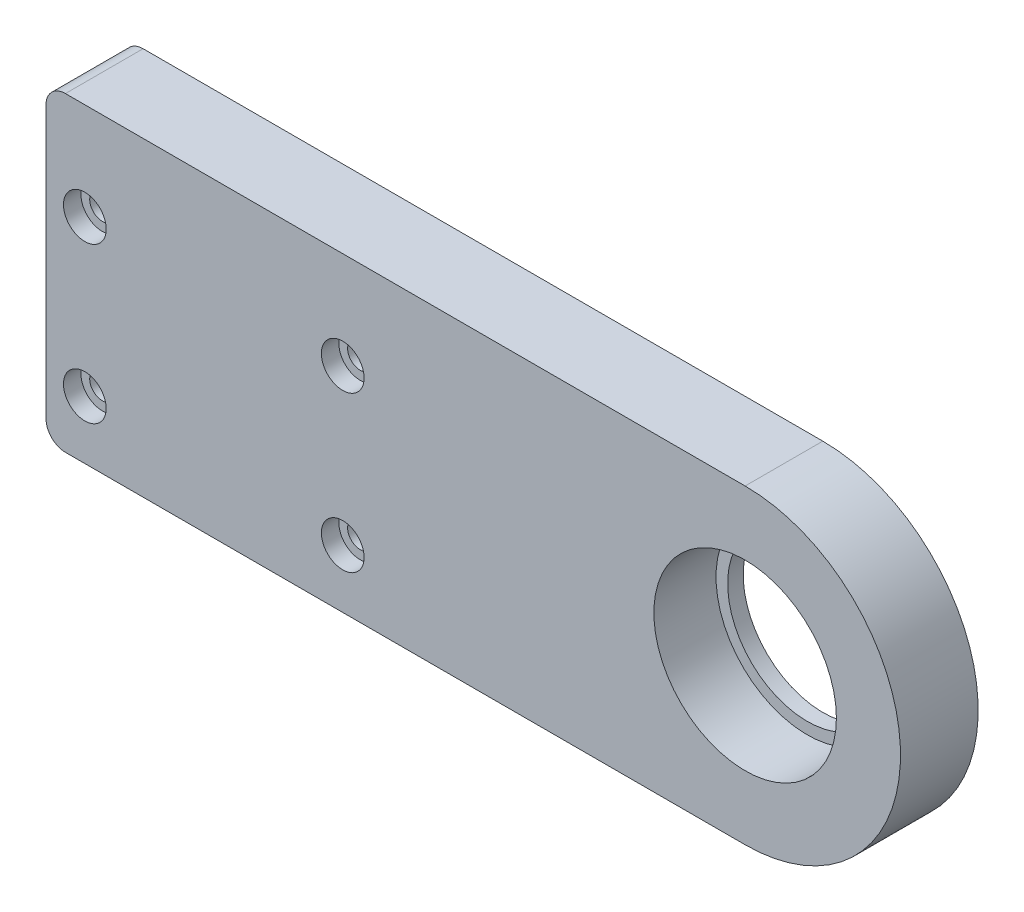
ISO-10303-21;
HEADER;
FILE_DESCRIPTION(('STEP AP214'),'2;1');
FILE_NAME('part.step','',(''),(''),'','','');
FILE_SCHEMA(('AUTOMOTIVE_DESIGN { 1 0 10303 214 1 1 1 1 }'));
ENDSEC;
DATA;
#1=APPLICATION_CONTEXT('core data for automotive mechanical design processes');
#2=APPLICATION_PROTOCOL_DEFINITION('international standard','automotive_design',2000,#1);
#3=PRODUCT_CONTEXT('',#1,'mechanical');
#4=PRODUCT('Part','Part','',(#3));
#5=PRODUCT_RELATED_PRODUCT_CATEGORY('part','',(#4));
#6=PRODUCT_DEFINITION_FORMATION('','',#4);
#7=PRODUCT_DEFINITION_CONTEXT('part definition',#1,'design');
#8=PRODUCT_DEFINITION('design','',#6,#7);
#9=PRODUCT_DEFINITION_SHAPE('','',#8);
#10=(LENGTH_UNIT() NAMED_UNIT(*) SI_UNIT(.MILLI.,.METRE.));
#11=(NAMED_UNIT(*) PLANE_ANGLE_UNIT() SI_UNIT($,.RADIAN.));
#12=(NAMED_UNIT(*) SI_UNIT($,.STERADIAN.) SOLID_ANGLE_UNIT());
#13=UNCERTAINTY_MEASURE_WITH_UNIT(LENGTH_MEASURE(1.E-05),#10,'distance_accuracy_value','');
#14=(GEOMETRIC_REPRESENTATION_CONTEXT(3) GLOBAL_UNCERTAINTY_ASSIGNED_CONTEXT((#13)) GLOBAL_UNIT_ASSIGNED_CONTEXT((#10,
#11,#12)) REPRESENTATION_CONTEXT('',''));
#15=CARTESIAN_POINT('',(0.,0.,0.));
#16=DIRECTION('',(0.,0.,1.));
#17=DIRECTION('',(1.,0.,0.));
#18=AXIS2_PLACEMENT_3D('',#15,#16,#17);
#19=CARTESIAN_POINT('',(-103.6,15.,-3.));
#20=DIRECTION('',(0.,0.,1.));
#21=DIRECTION('',(1.,0.,0.));
#22=AXIS2_PLACEMENT_3D('',#19,#20,#21);
#23=CYLINDRICAL_SURFACE('',#22,3.25000000000001);
#24=CARTESIAN_POINT('',(-103.6,15.,-3.));
#25=DIRECTION('',(0.,0.,1.));
#26=DIRECTION('',(1.,0.,0.));
#27=AXIS2_PLACEMENT_3D('',#24,#25,#26);
#28=CIRCLE('',#27,3.25000000000001);
#29=CARTESIAN_POINT('',(-100.35,15.,-3.));
#30=VERTEX_POINT('',#29);
#31=EDGE_CURVE('E589',#30,#30,#28,.T.);
#32=ORIENTED_EDGE('',*,*,#31,.F.);
#33=EDGE_LOOP('',(#32));
#34=FACE_BOUND('',#33,.T.);
#35=CARTESIAN_POINT('',(-103.6,15.,15.5));
#36=DIRECTION('',(0.,0.,1.));
#37=DIRECTION('',(1.,0.,0.));
#38=AXIS2_PLACEMENT_3D('',#35,#36,#37);
#39=CIRCLE('',#38,3.25000000000001);
#40=CARTESIAN_POINT('',(-100.35,15.,15.5));
#41=VERTEX_POINT('',#40);
#42=EDGE_CURVE('E246',#41,#41,#39,.F.);
#43=ORIENTED_EDGE('',*,*,#42,.F.);
#44=EDGE_LOOP('',(#43));
#45=FACE_BOUND('',#44,.T.);
#46=ADVANCED_FACE('F34',(#34,#45),#23,.F.);
#47=CARTESIAN_POINT('',(-170.,15.,-3.));
#48=DIRECTION('',(0.,0.,1.));
#49=DIRECTION('',(1.,0.,0.));
#50=AXIS2_PLACEMENT_3D('',#47,#48,#49);
#51=CYLINDRICAL_SURFACE('',#50,3.25000000000001);
#52=CARTESIAN_POINT('',(-170.,15.,-3.));
#53=DIRECTION('',(0.,0.,1.));
#54=DIRECTION('',(1.,0.,0.));
#55=AXIS2_PLACEMENT_3D('',#52,#53,#54);
#56=CIRCLE('',#55,3.25000000000001);
#57=CARTESIAN_POINT('',(-166.75,15.,-3.));
#58=VERTEX_POINT('',#57);
#59=EDGE_CURVE('E585',#58,#58,#56,.T.);
#60=ORIENTED_EDGE('',*,*,#59,.F.);
#61=EDGE_LOOP('',(#60));
#62=FACE_BOUND('',#61,.T.);
#63=CARTESIAN_POINT('',(-170.,15.,15.5));
#64=DIRECTION('',(0.,0.,1.));
#65=DIRECTION('',(1.,0.,0.));
#66=AXIS2_PLACEMENT_3D('',#63,#64,#65);
#67=CIRCLE('',#66,3.25000000000001);
#68=CARTESIAN_POINT('',(-166.75,15.,15.5));
#69=VERTEX_POINT('',#68);
#70=EDGE_CURVE('E243',#69,#69,#67,.F.);
#71=ORIENTED_EDGE('',*,*,#70,.F.);
#72=EDGE_LOOP('',(#71));
#73=FACE_BOUND('',#72,.T.);
#74=ADVANCED_FACE('F285',(#62,#73),#51,.F.);
#75=CARTESIAN_POINT('',(-170.,-25.,-3.));
#76=DIRECTION('',(0.,0.,1.));
#77=DIRECTION('',(1.,0.,0.));
#78=AXIS2_PLACEMENT_3D('',#75,#76,#77);
#79=CYLINDRICAL_SURFACE('',#78,3.25000000000001);
#80=CARTESIAN_POINT('',(-170.,-25.,-3.));
#81=DIRECTION('',(0.,0.,1.));
#82=DIRECTION('',(1.,0.,0.));
#83=AXIS2_PLACEMENT_3D('',#80,#81,#82);
#84=CIRCLE('',#83,3.25000000000001);
#85=CARTESIAN_POINT('',(-166.75,-25.,-3.));
#86=VERTEX_POINT('',#85);
#87=EDGE_CURVE('E582',#86,#86,#84,.T.);
#88=ORIENTED_EDGE('',*,*,#87,.F.);
#89=EDGE_LOOP('',(#88));
#90=FACE_BOUND('',#89,.T.);
#91=CARTESIAN_POINT('',(-170.,-25.,15.5));
#92=DIRECTION('',(0.,0.,1.));
#93=DIRECTION('',(1.,0.,0.));
#94=AXIS2_PLACEMENT_3D('',#91,#92,#93);
#95=CIRCLE('',#94,3.25000000000001);
#96=CARTESIAN_POINT('',(-166.75,-25.,15.5));
#97=VERTEX_POINT('',#96);
#98=EDGE_CURVE('E239',#97,#97,#95,.F.);
#99=ORIENTED_EDGE('',*,*,#98,.F.);
#100=EDGE_LOOP('',(#99));
#101=FACE_BOUND('',#100,.T.);
#102=ADVANCED_FACE('F291',(#90,#101),#79,.F.);
#103=CARTESIAN_POINT('',(-103.6,-25.,-3.));
#104=DIRECTION('',(0.,0.,1.));
#105=DIRECTION('',(1.,0.,0.));
#106=AXIS2_PLACEMENT_3D('',#103,#104,#105);
#107=CYLINDRICAL_SURFACE('',#106,3.25000000000001);
#108=CARTESIAN_POINT('',(-103.6,-25.,-3.));
#109=DIRECTION('',(0.,0.,1.));
#110=DIRECTION('',(1.,0.,0.));
#111=AXIS2_PLACEMENT_3D('',#108,#109,#110);
#112=CIRCLE('',#111,3.25000000000001);
#113=CARTESIAN_POINT('',(-100.35,-25.,-3.));
#114=VERTEX_POINT('',#113);
#115=EDGE_CURVE('E249',#114,#114,#112,.T.);
#116=ORIENTED_EDGE('',*,*,#115,.F.);
#117=EDGE_LOOP('',(#116));
#118=FACE_BOUND('',#117,.T.);
#119=CARTESIAN_POINT('',(-103.6,-25.,15.5));
#120=DIRECTION('',(0.,0.,1.));
#121=DIRECTION('',(1.,0.,0.));
#122=AXIS2_PLACEMENT_3D('',#119,#120,#121);
#123=CIRCLE('',#122,3.25000000000001);
#124=CARTESIAN_POINT('',(-100.35,-25.,15.5));
#125=VERTEX_POINT('',#124);
#126=EDGE_CURVE('E236',#125,#125,#123,.F.);
#127=ORIENTED_EDGE('',*,*,#126,.F.);
#128=EDGE_LOOP('',(#127));
#129=FACE_BOUND('',#128,.T.);
#130=ADVANCED_FACE('F298',(#118,#129),#107,.F.);
#131=CARTESIAN_POINT('',(0.,0.,0.));
#132=DIRECTION('',(0.,0.,1.));
#133=DIRECTION('',(1.,0.,0.));
#134=AXIS2_PLACEMENT_3D('',#131,#132,#133);
#135=PLANE('',#134);
#136=CARTESIAN_POINT('',(0.,0.,0.));
#137=DIRECTION('',(0.,0.,1.));
#138=DIRECTION('',(1.,0.,0.));
#139=AXIS2_PLACEMENT_3D('',#136,#137,#138);
#140=CIRCLE('',#139,20.5);
#141=CARTESIAN_POINT('',(20.5,0.,0.));
#142=VERTEX_POINT('',#141);
#143=EDGE_CURVE('E205',#142,#142,#140,.T.);
#144=ORIENTED_EDGE('',*,*,#143,.T.);
#145=EDGE_LOOP('',(#144));
#146=FACE_BOUND('',#145,.T.);
#147=DIRECTION('',(0.,-1.,0.));
#148=VECTOR('',#147,1.);
#149=CARTESIAN_POINT('',(-180.,40.,0.));
#150=LINE('',#149,#148);
#151=CARTESIAN_POINT('',(-180.,35.,0.));
#152=VERTEX_POINT('',#151);
#153=CARTESIAN_POINT('',(-180.,19.,0.));
#154=VERTEX_POINT('',#153);
#155=EDGE_CURVE('E162',#152,#154,#150,.T.);
#156=ORIENTED_EDGE('',*,*,#155,.F.);
#157=CARTESIAN_POINT('',(-175.,35.,0.));
#158=DIRECTION('',(0.,0.,1.));
#159=DIRECTION('',(1.,0.,0.));
#160=AXIS2_PLACEMENT_3D('',#157,#158,#159);
#161=CIRCLE('',#160,5.);
#162=CARTESIAN_POINT('',(-175.,40.,0.));
#163=VERTEX_POINT('',#162);
#164=EDGE_CURVE('E255',#152,#163,#161,.F.);
#165=ORIENTED_EDGE('',*,*,#164,.T.);
#166=DIRECTION('',(-1.,0.,0.));
#167=VECTOR('',#166,1.);
#168=CARTESIAN_POINT('',(0.,40.,0.));
#169=LINE('',#168,#167);
#170=CARTESIAN_POINT('',(0.,40.,0.));
#171=VERTEX_POINT('',#170);
#172=EDGE_CURVE('E222',#171,#163,#169,.T.);
#173=ORIENTED_EDGE('',*,*,#172,.F.);
#174=CARTESIAN_POINT('',(0.,0.,0.));
#175=DIRECTION('',(0.,0.,1.));
#176=DIRECTION('',(1.,0.,0.));
#177=AXIS2_PLACEMENT_3D('',#174,#175,#176);
#178=CIRCLE('',#177,40.);
#179=CARTESIAN_POINT('',(0.,-40.,0.));
#180=VERTEX_POINT('',#179);
#181=EDGE_CURVE('E208',#180,#171,#178,.T.);
#182=ORIENTED_EDGE('',*,*,#181,.F.);
#183=DIRECTION('',(1.,0.,0.));
#184=VECTOR('',#183,1.);
#185=CARTESIAN_POINT('',(-180.,-40.,0.));
#186=LINE('',#185,#184);
#187=CARTESIAN_POINT('',(-175.,-40.,0.));
#188=VERTEX_POINT('',#187);
#189=EDGE_CURVE('E213',#188,#180,#186,.T.);
#190=ORIENTED_EDGE('',*,*,#189,.F.);
#191=CARTESIAN_POINT('',(-175.,-35.,0.));
#192=DIRECTION('',(0.,0.,1.));
#193=DIRECTION('',(1.,0.,0.));
#194=AXIS2_PLACEMENT_3D('',#191,#192,#193);
#195=CIRCLE('',#194,5.);
#196=CARTESIAN_POINT('',(-180.,-35.,0.));
#197=VERTEX_POINT('',#196);
#198=EDGE_CURVE('E253',#188,#197,#195,.F.);
#199=ORIENTED_EDGE('',*,*,#198,.T.);
#200=CARTESIAN_POINT('',(-180.,-29.,0.));
#201=VERTEX_POINT('',#200);
#202=EDGE_CURVE('E224',#201,#197,#150,.T.);
#203=ORIENTED_EDGE('',*,*,#202,.F.);
#204=DIRECTION('',(-1.,0.,0.));
#205=VECTOR('',#204,1.);
#206=CARTESIAN_POINT('',(-180.,-29.,0.));
#207=LINE('',#206,#205);
#208=CARTESIAN_POINT('',(-95.,-29.,0.));
#209=VERTEX_POINT('',#208);
#210=EDGE_CURVE('E176',#209,#201,#207,.T.);
#211=ORIENTED_EDGE('',*,*,#210,.F.);
#212=DIRECTION('',(0.,-1.,0.));
#213=VECTOR('',#212,1.);
#214=CARTESIAN_POINT('',(-95.,-29.,0.));
#215=LINE('',#214,#213);
#216=CARTESIAN_POINT('',(-95.,-21.,0.));
#217=VERTEX_POINT('',#216);
#218=EDGE_CURVE('E166',#217,#209,#215,.T.);
#219=ORIENTED_EDGE('',*,*,#218,.F.);
#220=DIRECTION('',(1.,0.,0.));
#221=VECTOR('',#220,1.);
#222=CARTESIAN_POINT('',(-180.,-21.,0.));
#223=LINE('',#222,#221);
#224=CARTESIAN_POINT('',(-180.,-21.,0.));
#225=VERTEX_POINT('',#224);
#226=EDGE_CURVE('E163',#225,#217,#223,.T.);
#227=ORIENTED_EDGE('',*,*,#226,.F.);
#228=CARTESIAN_POINT('',(-180.,11.,0.));
#229=VERTEX_POINT('',#228);
#230=EDGE_CURVE('E226',#229,#225,#150,.T.);
#231=ORIENTED_EDGE('',*,*,#230,.F.);
#232=DIRECTION('',(-1.,0.,0.));
#233=VECTOR('',#232,1.);
#234=CARTESIAN_POINT('',(-180.,11.,0.));
#235=LINE('',#234,#233);
#236=CARTESIAN_POINT('',(-95.,11.,0.));
#237=VERTEX_POINT('',#236);
#238=EDGE_CURVE('E156',#237,#229,#235,.T.);
#239=ORIENTED_EDGE('',*,*,#238,.F.);
#240=DIRECTION('',(0.,-1.,0.));
#241=VECTOR('',#240,1.);
#242=CARTESIAN_POINT('',(-95.,11.,0.));
#243=LINE('',#242,#241);
#244=CARTESIAN_POINT('',(-95.,19.,0.));
#245=VERTEX_POINT('',#244);
#246=EDGE_CURVE('E597',#245,#237,#243,.T.);
#247=ORIENTED_EDGE('',*,*,#246,.F.);
#248=DIRECTION('',(1.,0.,0.));
#249=VECTOR('',#248,1.);
#250=CARTESIAN_POINT('',(-180.,19.,0.));
#251=LINE('',#250,#249);
#252=EDGE_CURVE('E591',#154,#245,#251,.T.);
#253=ORIENTED_EDGE('',*,*,#252,.F.);
#254=EDGE_LOOP('',(#156,#165,#173,#182,#190,#199,#203,#211,#219,#227,#231,#239,#247,#253));
#255=FACE_BOUND('',#254,.T.);
#256=ADVANCED_FACE('F266',(#146,#255),#135,.F.);
#257=CARTESIAN_POINT('',(0.,0.,20.));
#258=DIRECTION('',(0.,0.,-1.));
#259=DIRECTION('',(-1.,0.,0.));
#260=AXIS2_PLACEMENT_3D('',#257,#258,#259);
#261=CYLINDRICAL_SURFACE('',#260,20.5);
#262=ORIENTED_EDGE('',*,*,#143,.F.);
#263=EDGE_LOOP('',(#262));
#264=FACE_BOUND('',#263,.T.);
#265=CARTESIAN_POINT('',(0.,0.,4.));
#266=DIRECTION('',(0.,0.,1.));
#267=DIRECTION('',(1.,0.,0.));
#268=AXIS2_PLACEMENT_3D('',#265,#266,#267);
#269=CIRCLE('',#268,20.5);
#270=CARTESIAN_POINT('',(20.5,0.,4.));
#271=VERTEX_POINT('',#270);
#272=EDGE_CURVE('E202',#271,#271,#269,.T.);
#273=ORIENTED_EDGE('',*,*,#272,.T.);
#274=EDGE_LOOP('',(#273));
#275=FACE_BOUND('',#274,.T.);
#276=ADVANCED_FACE('F338',(#264,#275),#261,.F.);
#277=CARTESIAN_POINT('',(0.,0.,20.));
#278=DIRECTION('',(0.,0.,1.));
#279=DIRECTION('',(1.,0.,0.));
#280=AXIS2_PLACEMENT_3D('',#277,#278,#279);
#281=PLANE('',#280);
#282=CARTESIAN_POINT('',(-170.,-25.,20.));
#283=DIRECTION('',(0.,0.,1.));
#284=DIRECTION('',(1.,0.,0.));
#285=AXIS2_PLACEMENT_3D('',#282,#283,#284);
#286=CIRCLE('',#285,5.50000000000002);
#287=CARTESIAN_POINT('',(-164.5,-25.,20.));
#288=VERTEX_POINT('',#287);
#289=EDGE_CURVE('E625',#288,#288,#286,.T.);
#290=ORIENTED_EDGE('',*,*,#289,.F.);
#291=EDGE_LOOP('',(#290));
#292=FACE_BOUND('',#291,.T.);
#293=CARTESIAN_POINT('',(-103.6,-25.,20.));
#294=DIRECTION('',(0.,0.,1.));
#295=DIRECTION('',(1.,0.,0.));
#296=AXIS2_PLACEMENT_3D('',#293,#294,#295);
#297=CIRCLE('',#296,5.49999999999999);
#298=CARTESIAN_POINT('',(-98.1,-25.,20.));
#299=VERTEX_POINT('',#298);
#300=EDGE_CURVE('E631',#299,#299,#297,.T.);
#301=ORIENTED_EDGE('',*,*,#300,.F.);
#302=EDGE_LOOP('',(#301));
#303=FACE_BOUND('',#302,.T.);
#304=CARTESIAN_POINT('',(-103.6,15.,20.));
#305=DIRECTION('',(0.,0.,1.));
#306=DIRECTION('',(1.,0.,0.));
#307=AXIS2_PLACEMENT_3D('',#304,#305,#306);
#308=CIRCLE('',#307,5.49999999999999);
#309=CARTESIAN_POINT('',(-98.1,15.,20.));
#310=VERTEX_POINT('',#309);
#311=EDGE_CURVE('E637',#310,#310,#308,.T.);
#312=ORIENTED_EDGE('',*,*,#311,.F.);
#313=EDGE_LOOP('',(#312));
#314=FACE_BOUND('',#313,.T.);
#315=CARTESIAN_POINT('',(-170.,15.,20.));
#316=DIRECTION('',(0.,0.,1.));
#317=DIRECTION('',(1.,0.,0.));
#318=AXIS2_PLACEMENT_3D('',#315,#316,#317);
#319=CIRCLE('',#318,5.50000000000002);
#320=CARTESIAN_POINT('',(-164.5,15.,20.));
#321=VERTEX_POINT('',#320);
#322=EDGE_CURVE('E619',#321,#321,#319,.T.);
#323=ORIENTED_EDGE('',*,*,#322,.F.);
#324=EDGE_LOOP('',(#323));
#325=FACE_BOUND('',#324,.T.);
#326=CARTESIAN_POINT('',(0.,0.,20.));
#327=DIRECTION('',(0.,0.,1.));
#328=DIRECTION('',(1.,0.,0.));
#329=AXIS2_PLACEMENT_3D('',#326,#327,#328);
#330=CIRCLE('',#329,23.5);
#331=CARTESIAN_POINT('',(23.5,0.,20.));
#332=VERTEX_POINT('',#331);
#333=EDGE_CURVE('E198',#332,#332,#330,.T.);
#334=ORIENTED_EDGE('',*,*,#333,.F.);
#335=EDGE_LOOP('',(#334));
#336=FACE_BOUND('',#335,.T.);
#337=DIRECTION('',(-1.,0.,0.));
#338=VECTOR('',#337,1.);
#339=CARTESIAN_POINT('',(0.,40.,20.));
#340=LINE('',#339,#338);
#341=CARTESIAN_POINT('',(0.,40.,20.));
#342=VERTEX_POINT('',#341);
#343=CARTESIAN_POINT('',(-175.,40.,20.));
#344=VERTEX_POINT('',#343);
#345=EDGE_CURVE('E212',#342,#344,#340,.T.);
#346=ORIENTED_EDGE('',*,*,#345,.T.);
#347=CARTESIAN_POINT('',(-175.,35.,20.));
#348=DIRECTION('',(0.,0.,1.));
#349=DIRECTION('',(1.,0.,0.));
#350=AXIS2_PLACEMENT_3D('',#347,#348,#349);
#351=CIRCLE('',#350,5.);
#352=CARTESIAN_POINT('',(-180.,35.,20.));
#353=VERTEX_POINT('',#352);
#354=EDGE_CURVE('E42',#344,#353,#351,.T.);
#355=ORIENTED_EDGE('',*,*,#354,.T.);
#356=DIRECTION('',(0.,-1.,0.));
#357=VECTOR('',#356,1.);
#358=CARTESIAN_POINT('',(-180.,40.,20.));
#359=LINE('',#358,#357);
#360=CARTESIAN_POINT('',(-180.,-35.,20.));
#361=VERTEX_POINT('',#360);
#362=EDGE_CURVE('E215',#353,#361,#359,.T.);
#363=ORIENTED_EDGE('',*,*,#362,.T.);
#364=CARTESIAN_POINT('',(-175.,-35.,20.));
#365=DIRECTION('',(0.,0.,1.));
#366=DIRECTION('',(1.,0.,0.));
#367=AXIS2_PLACEMENT_3D('',#364,#365,#366);
#368=CIRCLE('',#367,5.);
#369=CARTESIAN_POINT('',(-175.,-40.,20.));
#370=VERTEX_POINT('',#369);
#371=EDGE_CURVE('E49',#361,#370,#368,.T.);
#372=ORIENTED_EDGE('',*,*,#371,.T.);
#373=DIRECTION('',(1.,0.,0.));
#374=VECTOR('',#373,1.);
#375=CARTESIAN_POINT('',(-180.,-40.,20.));
#376=LINE('',#375,#374);
#377=CARTESIAN_POINT('',(0.,-40.,20.));
#378=VERTEX_POINT('',#377);
#379=EDGE_CURVE('E217',#370,#378,#376,.T.);
#380=ORIENTED_EDGE('',*,*,#379,.T.);
#381=CARTESIAN_POINT('',(0.,0.,20.));
#382=DIRECTION('',(0.,0.,1.));
#383=DIRECTION('',(1.,0.,0.));
#384=AXIS2_PLACEMENT_3D('',#381,#382,#383);
#385=CIRCLE('',#384,40.);
#386=EDGE_CURVE('E209',#378,#342,#385,.T.);
#387=ORIENTED_EDGE('',*,*,#386,.T.);
#388=EDGE_LOOP('',(#346,#355,#363,#372,#380,#387));
#389=FACE_BOUND('',#388,.T.);
#390=ADVANCED_FACE('F259',(#292,#303,#314,#325,#336,#389),#281,.T.);
#391=CARTESIAN_POINT('',(0.,0.,20.));
#392=DIRECTION('',(0.,0.,-1.));
#393=DIRECTION('',(-1.,0.,0.));
#394=AXIS2_PLACEMENT_3D('',#391,#392,#393);
#395=CYLINDRICAL_SURFACE('',#394,40.);
#396=ORIENTED_EDGE('',*,*,#181,.T.);
#397=DIRECTION('',(0.,0.,-1.));
#398=VECTOR('',#397,1.);
#399=CARTESIAN_POINT('',(0.,40.,20.));
#400=LINE('',#399,#398);
#401=EDGE_CURVE('E230',#342,#171,#400,.T.);
#402=ORIENTED_EDGE('',*,*,#401,.F.);
#403=ORIENTED_EDGE('',*,*,#386,.F.);
#404=DIRECTION('',(0.,0.,-1.));
#405=VECTOR('',#404,1.);
#406=CARTESIAN_POINT('',(0.,-40.,20.));
#407=LINE('',#406,#405);
#408=EDGE_CURVE('E219',#378,#180,#407,.T.);
#409=ORIENTED_EDGE('',*,*,#408,.T.);
#410=EDGE_LOOP('',(#396,#402,#403,#409));
#411=FACE_BOUND('',#410,.T.);
#412=ADVANCED_FACE('F272',(#411),#395,.T.);
#413=CARTESIAN_POINT('',(0.,40.,20.));
#414=DIRECTION('',(0.,-1.,0.));
#415=DIRECTION('',(0.,0.,-1.));
#416=AXIS2_PLACEMENT_3D('',#413,#414,#415);
#417=PLANE('',#416);
#418=ORIENTED_EDGE('',*,*,#172,.T.);
#419=DIRECTION('',(0.,0.,-1.));
#420=VECTOR('',#419,1.);
#421=CARTESIAN_POINT('',(-175.,40.,20.));
#422=LINE('',#421,#420);
#423=EDGE_CURVE('E57',#163,#344,#422,.F.);
#424=ORIENTED_EDGE('',*,*,#423,.T.);
#425=ORIENTED_EDGE('',*,*,#345,.F.);
#426=ORIENTED_EDGE('',*,*,#401,.T.);
#427=EDGE_LOOP('',(#418,#424,#425,#426));
#428=FACE_BOUND('',#427,.T.);
#429=ADVANCED_FACE('F268',(#428),#417,.F.);
#430=CARTESIAN_POINT('',(-180.,40.,20.));
#431=DIRECTION('',(1.,0.,0.));
#432=DIRECTION('',(0.,0.,-1.));
#433=AXIS2_PLACEMENT_3D('',#430,#431,#432);
#434=PLANE('',#433);
#435=ORIENTED_EDGE('',*,*,#362,.F.);
#436=DIRECTION('',(0.,0.,-1.));
#437=VECTOR('',#436,1.);
#438=CARTESIAN_POINT('',(-180.,35.,20.));
#439=LINE('',#438,#437);
#440=EDGE_CURVE('E251',#353,#152,#439,.T.);
#441=ORIENTED_EDGE('',*,*,#440,.T.);
#442=ORIENTED_EDGE('',*,*,#155,.T.);
#443=DIRECTION('',(0.,0.,1.));
#444=VECTOR('',#443,1.);
#445=CARTESIAN_POINT('',(-180.,19.,-3.));
#446=LINE('',#445,#444);
#447=CARTESIAN_POINT('',(-180.,19.,-3.));
#448=VERTEX_POINT('',#447);
#449=EDGE_CURVE('E141',#448,#154,#446,.T.);
#450=ORIENTED_EDGE('',*,*,#449,.F.);
#451=DIRECTION('',(0.,1.,0.));
#452=VECTOR('',#451,1.);
#453=CARTESIAN_POINT('',(-180.,11.,-3.));
#454=LINE('',#453,#452);
#455=CARTESIAN_POINT('',(-180.,11.,-3.));
#456=VERTEX_POINT('',#455);
#457=EDGE_CURVE('E148',#456,#448,#454,.T.);
#458=ORIENTED_EDGE('',*,*,#457,.F.);
#459=DIRECTION('',(0.,0.,1.));
#460=VECTOR('',#459,1.);
#461=CARTESIAN_POINT('',(-180.,11.,-3.));
#462=LINE('',#461,#460);
#463=EDGE_CURVE('E595',#456,#229,#462,.T.);
#464=ORIENTED_EDGE('',*,*,#463,.T.);
#465=ORIENTED_EDGE('',*,*,#230,.T.);
#466=DIRECTION('',(0.,0.,1.));
#467=VECTOR('',#466,1.);
#468=CARTESIAN_POINT('',(-180.,-21.,-3.));
#469=LINE('',#468,#467);
#470=CARTESIAN_POINT('',(-180.,-21.,-3.));
#471=VERTEX_POINT('',#470);
#472=EDGE_CURVE('E195',#471,#225,#469,.T.);
#473=ORIENTED_EDGE('',*,*,#472,.F.);
#474=DIRECTION('',(0.,1.,0.));
#475=VECTOR('',#474,1.);
#476=CARTESIAN_POINT('',(-180.,-29.,-3.));
#477=LINE('',#476,#475);
#478=CARTESIAN_POINT('',(-180.,-29.,-3.));
#479=VERTEX_POINT('',#478);
#480=EDGE_CURVE('E172',#479,#471,#477,.T.);
#481=ORIENTED_EDGE('',*,*,#480,.F.);
#482=DIRECTION('',(0.,0.,1.));
#483=VECTOR('',#482,1.);
#484=CARTESIAN_POINT('',(-180.,-29.,-3.));
#485=LINE('',#484,#483);
#486=EDGE_CURVE('E181',#479,#201,#485,.T.);
#487=ORIENTED_EDGE('',*,*,#486,.T.);
#488=ORIENTED_EDGE('',*,*,#202,.T.);
#489=DIRECTION('',(0.,0.,-1.));
#490=VECTOR('',#489,1.);
#491=CARTESIAN_POINT('',(-180.,-35.,20.));
#492=LINE('',#491,#490);
#493=EDGE_CURVE('E233',#197,#361,#492,.F.);
#494=ORIENTED_EDGE('',*,*,#493,.T.);
#495=EDGE_LOOP('',(#435,#441,#442,#450,#458,#464,#465,#473,#481,#487,#488,#494));
#496=FACE_BOUND('',#495,.T.);
#497=ADVANCED_FACE('F159',(#496),#434,.F.);
#498=CARTESIAN_POINT('',(-180.,-40.,20.));
#499=DIRECTION('',(0.,1.,0.));
#500=DIRECTION('',(0.,0.,1.));
#501=AXIS2_PLACEMENT_3D('',#498,#499,#500);
#502=PLANE('',#501);
#503=ORIENTED_EDGE('',*,*,#379,.F.);
#504=DIRECTION('',(0.,0.,-1.));
#505=VECTOR('',#504,1.);
#506=CARTESIAN_POINT('',(-175.,-40.,20.));
#507=LINE('',#506,#505);
#508=EDGE_CURVE('E11',#370,#188,#507,.T.);
#509=ORIENTED_EDGE('',*,*,#508,.T.);
#510=ORIENTED_EDGE('',*,*,#189,.T.);
#511=ORIENTED_EDGE('',*,*,#408,.F.);
#512=EDGE_LOOP('',(#503,#509,#510,#511));
#513=FACE_BOUND('',#512,.T.);
#514=ADVANCED_FACE('F276',(#513),#502,.F.);
#515=CARTESIAN_POINT('',(0.,0.,4.));
#516=DIRECTION('',(0.,0.,1.));
#517=DIRECTION('',(1.,0.,0.));
#518=AXIS2_PLACEMENT_3D('',#515,#516,#517);
#519=CYLINDRICAL_SURFACE('',#518,23.5);
#520=CARTESIAN_POINT('',(0.,0.,4.));
#521=DIRECTION('',(0.,0.,1.));
#522=DIRECTION('',(1.,0.,0.));
#523=AXIS2_PLACEMENT_3D('',#520,#521,#522);
#524=CIRCLE('',#523,23.5);
#525=CARTESIAN_POINT('',(23.5,0.,4.));
#526=VERTEX_POINT('',#525);
#527=EDGE_CURVE('E199',#526,#526,#524,.T.);
#528=ORIENTED_EDGE('',*,*,#527,.F.);
#529=EDGE_LOOP('',(#528));
#530=FACE_BOUND('',#529,.T.);
#531=ORIENTED_EDGE('',*,*,#333,.T.);
#532=EDGE_LOOP('',(#531));
#533=FACE_BOUND('',#532,.T.);
#534=ADVANCED_FACE('F333',(#530,#533),#519,.F.);
#535=CARTESIAN_POINT('',(0.,0.,4.));
#536=DIRECTION('',(0.,0.,1.));
#537=DIRECTION('',(1.,0.,0.));
#538=AXIS2_PLACEMENT_3D('',#535,#536,#537);
#539=PLANE('',#538);
#540=ORIENTED_EDGE('',*,*,#272,.F.);
#541=EDGE_LOOP('',(#540));
#542=FACE_BOUND('',#541,.T.);
#543=ORIENTED_EDGE('',*,*,#527,.T.);
#544=EDGE_LOOP('',(#543));
#545=FACE_BOUND('',#544,.T.);
#546=ADVANCED_FACE('F329',(#542,#545),#539,.T.);
#547=CARTESIAN_POINT('',(-180.,-21.,-3.));
#548=DIRECTION('',(0.,-1.,0.));
#549=DIRECTION('',(0.,0.,-1.));
#550=AXIS2_PLACEMENT_3D('',#547,#548,#549);
#551=PLANE('',#550);
#552=ORIENTED_EDGE('',*,*,#226,.T.);
#553=DIRECTION('',(0.,0.,1.));
#554=VECTOR('',#553,1.);
#555=CARTESIAN_POINT('',(-95.,-21.,-3.));
#556=LINE('',#555,#554);
#557=CARTESIAN_POINT('',(-95.,-21.,-3.));
#558=VERTEX_POINT('',#557);
#559=EDGE_CURVE('E192',#558,#217,#556,.T.);
#560=ORIENTED_EDGE('',*,*,#559,.F.);
#561=DIRECTION('',(1.,0.,0.));
#562=VECTOR('',#561,1.);
#563=CARTESIAN_POINT('',(-180.,-21.,-3.));
#564=LINE('',#563,#562);
#565=EDGE_CURVE('E175',#471,#558,#564,.T.);
#566=ORIENTED_EDGE('',*,*,#565,.F.);
#567=ORIENTED_EDGE('',*,*,#472,.T.);
#568=EDGE_LOOP('',(#552,#560,#566,#567));
#569=FACE_BOUND('',#568,.T.);
#570=ADVANCED_FACE('F325',(#569),#551,.F.);
#571=CARTESIAN_POINT('',(-95.,-29.,-3.));
#572=DIRECTION('',(-1.,0.,0.));
#573=DIRECTION('',(0.,0.,1.));
#574=AXIS2_PLACEMENT_3D('',#571,#572,#573);
#575=PLANE('',#574);
#576=ORIENTED_EDGE('',*,*,#218,.T.);
#577=DIRECTION('',(0.,0.,1.));
#578=VECTOR('',#577,1.);
#579=CARTESIAN_POINT('',(-95.,-29.,-3.));
#580=LINE('',#579,#578);
#581=CARTESIAN_POINT('',(-95.,-29.,-3.));
#582=VERTEX_POINT('',#581);
#583=EDGE_CURVE('E189',#582,#209,#580,.T.);
#584=ORIENTED_EDGE('',*,*,#583,.F.);
#585=DIRECTION('',(0.,-1.,0.));
#586=VECTOR('',#585,1.);
#587=CARTESIAN_POINT('',(-95.,-29.,-3.));
#588=LINE('',#587,#586);
#589=EDGE_CURVE('E178',#558,#582,#588,.T.);
#590=ORIENTED_EDGE('',*,*,#589,.F.);
#591=ORIENTED_EDGE('',*,*,#559,.T.);
#592=EDGE_LOOP('',(#576,#584,#590,#591));
#593=FACE_BOUND('',#592,.T.);
#594=ADVANCED_FACE('F321',(#593),#575,.F.);
#595=CARTESIAN_POINT('',(-180.,-29.,-3.));
#596=DIRECTION('',(0.,1.,0.));
#597=DIRECTION('',(-1.,0.,0.));
#598=AXIS2_PLACEMENT_3D('',#595,#596,#597);
#599=PLANE('',#598);
#600=ORIENTED_EDGE('',*,*,#210,.T.);
#601=ORIENTED_EDGE('',*,*,#486,.F.);
#602=DIRECTION('',(-1.,0.,0.));
#603=VECTOR('',#602,1.);
#604=CARTESIAN_POINT('',(-180.,-29.,-3.));
#605=LINE('',#604,#603);
#606=EDGE_CURVE('E180',#582,#479,#605,.T.);
#607=ORIENTED_EDGE('',*,*,#606,.F.);
#608=ORIENTED_EDGE('',*,*,#583,.T.);
#609=EDGE_LOOP('',(#600,#601,#607,#608));
#610=FACE_BOUND('',#609,.T.);
#611=ADVANCED_FACE('F317',(#610),#599,.F.);
#612=CARTESIAN_POINT('',(0.,0.,-3.));
#613=DIRECTION('',(0.,0.,-1.));
#614=DIRECTION('',(-1.,0.,0.));
#615=AXIS2_PLACEMENT_3D('',#612,#613,#614);
#616=PLANE('',#615);
#617=ORIENTED_EDGE('',*,*,#115,.T.);
#618=EDGE_LOOP('',(#617));
#619=FACE_BOUND('',#618,.T.);
#620=ORIENTED_EDGE('',*,*,#87,.T.);
#621=EDGE_LOOP('',(#620));
#622=FACE_BOUND('',#621,.T.);
#623=ORIENTED_EDGE('',*,*,#480,.T.);
#624=ORIENTED_EDGE('',*,*,#565,.T.);
#625=ORIENTED_EDGE('',*,*,#589,.T.);
#626=ORIENTED_EDGE('',*,*,#606,.T.);
#627=EDGE_LOOP('',(#623,#624,#625,#626));
#628=FACE_BOUND('',#627,.T.);
#629=ADVANCED_FACE('F314',(#619,#622,#628),#616,.T.);
#630=CARTESIAN_POINT('',(-180.,19.,-3.));
#631=DIRECTION('',(0.,-1.,0.));
#632=DIRECTION('',(1.,0.,0.));
#633=AXIS2_PLACEMENT_3D('',#630,#631,#632);
#634=PLANE('',#633);
#635=ORIENTED_EDGE('',*,*,#252,.T.);
#636=DIRECTION('',(0.,0.,1.));
#637=VECTOR('',#636,1.);
#638=CARTESIAN_POINT('',(-95.,19.,-3.));
#639=LINE('',#638,#637);
#640=CARTESIAN_POINT('',(-95.,19.,-3.));
#641=VERTEX_POINT('',#640);
#642=EDGE_CURVE('E144',#641,#245,#639,.T.);
#643=ORIENTED_EDGE('',*,*,#642,.F.);
#644=DIRECTION('',(1.,0.,0.));
#645=VECTOR('',#644,1.);
#646=CARTESIAN_POINT('',(-180.,19.,-3.));
#647=LINE('',#646,#645);
#648=EDGE_CURVE('E137',#448,#641,#647,.T.);
#649=ORIENTED_EDGE('',*,*,#648,.F.);
#650=ORIENTED_EDGE('',*,*,#449,.T.);
#651=EDGE_LOOP('',(#635,#643,#649,#650));
#652=FACE_BOUND('',#651,.T.);
#653=ADVANCED_FACE('F139',(#652),#634,.F.);
#654=CARTESIAN_POINT('',(-95.,11.,-3.));
#655=DIRECTION('',(-1.,0.,0.));
#656=DIRECTION('',(0.,0.,1.));
#657=AXIS2_PLACEMENT_3D('',#654,#655,#656);
#658=PLANE('',#657);
#659=ORIENTED_EDGE('',*,*,#246,.T.);
#660=DIRECTION('',(0.,0.,1.));
#661=VECTOR('',#660,1.);
#662=CARTESIAN_POINT('',(-95.,11.,-3.));
#663=LINE('',#662,#661);
#664=CARTESIAN_POINT('',(-95.,11.,-3.));
#665=VERTEX_POINT('',#664);
#666=EDGE_CURVE('E168',#665,#237,#663,.T.);
#667=ORIENTED_EDGE('',*,*,#666,.F.);
#668=DIRECTION('',(0.,-1.,0.));
#669=VECTOR('',#668,1.);
#670=CARTESIAN_POINT('',(-95.,11.,-3.));
#671=LINE('',#670,#669);
#672=EDGE_CURVE('E147',#641,#665,#671,.T.);
#673=ORIENTED_EDGE('',*,*,#672,.F.);
#674=ORIENTED_EDGE('',*,*,#642,.T.);
#675=EDGE_LOOP('',(#659,#667,#673,#674));
#676=FACE_BOUND('',#675,.T.);
#677=ADVANCED_FACE('F307',(#676),#658,.F.);
#678=CARTESIAN_POINT('',(-180.,11.,-3.));
#679=DIRECTION('',(0.,1.,0.));
#680=DIRECTION('',(-1.,0.,0.));
#681=AXIS2_PLACEMENT_3D('',#678,#679,#680);
#682=PLANE('',#681);
#683=ORIENTED_EDGE('',*,*,#238,.T.);
#684=ORIENTED_EDGE('',*,*,#463,.F.);
#685=DIRECTION('',(-1.,0.,0.));
#686=VECTOR('',#685,1.);
#687=CARTESIAN_POINT('',(-180.,11.,-3.));
#688=LINE('',#687,#686);
#689=EDGE_CURVE('E153',#665,#456,#688,.T.);
#690=ORIENTED_EDGE('',*,*,#689,.F.);
#691=ORIENTED_EDGE('',*,*,#666,.T.);
#692=EDGE_LOOP('',(#683,#684,#690,#691));
#693=FACE_BOUND('',#692,.T.);
#694=ADVANCED_FACE('F303',(#693),#682,.F.);
#695=CARTESIAN_POINT('',(0.,0.,-3.));
#696=DIRECTION('',(0.,0.,-1.));
#697=DIRECTION('',(-1.,0.,0.));
#698=AXIS2_PLACEMENT_3D('',#695,#696,#697);
#699=PLANE('',#698);
#700=ORIENTED_EDGE('',*,*,#59,.T.);
#701=EDGE_LOOP('',(#700));
#702=FACE_BOUND('',#701,.T.);
#703=ORIENTED_EDGE('',*,*,#31,.T.);
#704=EDGE_LOOP('',(#703));
#705=FACE_BOUND('',#704,.T.);
#706=ORIENTED_EDGE('',*,*,#457,.T.);
#707=ORIENTED_EDGE('',*,*,#648,.T.);
#708=ORIENTED_EDGE('',*,*,#672,.T.);
#709=ORIENTED_EDGE('',*,*,#689,.T.);
#710=EDGE_LOOP('',(#706,#707,#708,#709));
#711=FACE_BOUND('',#710,.T.);
#712=ADVANCED_FACE('F151',(#702,#705,#711),#699,.T.);
#713=CARTESIAN_POINT('',(-103.6,-25.,15.5));
#714=DIRECTION('',(0.,0.,1.));
#715=DIRECTION('',(1.,0.,0.));
#716=AXIS2_PLACEMENT_3D('',#713,#714,#715);
#717=PLANE('',#716);
#718=CARTESIAN_POINT('',(-103.6,-25.,15.5));
#719=DIRECTION('',(0.,0.,1.));
#720=DIRECTION('',(1.,0.,0.));
#721=AXIS2_PLACEMENT_3D('',#718,#719,#720);
#722=CIRCLE('',#721,5.49999999999999);
#723=CARTESIAN_POINT('',(-98.1,-25.,15.5));
#724=VERTEX_POINT('',#723);
#725=EDGE_CURVE('E634',#724,#724,#722,.T.);
#726=ORIENTED_EDGE('',*,*,#725,.T.);
#727=EDGE_LOOP('',(#726));
#728=FACE_BOUND('',#727,.T.);
#729=ORIENTED_EDGE('',*,*,#126,.T.);
#730=EDGE_LOOP('',(#729));
#731=FACE_BOUND('',#730,.T.);
#732=ADVANCED_FACE('F302',(#728,#731),#717,.T.);
#733=CARTESIAN_POINT('',(-103.6,-25.,15.5));
#734=DIRECTION('',(0.,0.,1.));
#735=DIRECTION('',(1.,0.,0.));
#736=AXIS2_PLACEMENT_3D('',#733,#734,#735);
#737=CYLINDRICAL_SURFACE('',#736,5.49999999999999);
#738=ORIENTED_EDGE('',*,*,#725,.F.);
#739=EDGE_LOOP('',(#738));
#740=FACE_BOUND('',#739,.T.);
#741=ORIENTED_EDGE('',*,*,#300,.T.);
#742=EDGE_LOOP('',(#741));
#743=FACE_BOUND('',#742,.T.);
#744=ADVANCED_FACE('F419',(#740,#743),#737,.F.);
#745=CARTESIAN_POINT('',(-170.,-25.,15.5));
#746=DIRECTION('',(0.,0.,1.));
#747=DIRECTION('',(1.,0.,0.));
#748=AXIS2_PLACEMENT_3D('',#745,#746,#747);
#749=PLANE('',#748);
#750=CARTESIAN_POINT('',(-170.,-25.,15.5));
#751=DIRECTION('',(0.,0.,1.));
#752=DIRECTION('',(1.,0.,0.));
#753=AXIS2_PLACEMENT_3D('',#750,#751,#752);
#754=CIRCLE('',#753,5.50000000000002);
#755=CARTESIAN_POINT('',(-164.5,-25.,15.5));
#756=VERTEX_POINT('',#755);
#757=EDGE_CURVE('E628',#756,#756,#754,.T.);
#758=ORIENTED_EDGE('',*,*,#757,.T.);
#759=EDGE_LOOP('',(#758));
#760=FACE_BOUND('',#759,.T.);
#761=ORIENTED_EDGE('',*,*,#98,.T.);
#762=EDGE_LOOP('',(#761));
#763=FACE_BOUND('',#762,.T.);
#764=ADVANCED_FACE('F428',(#760,#763),#749,.T.);
#765=CARTESIAN_POINT('',(-170.,-25.,15.5));
#766=DIRECTION('',(0.,0.,1.));
#767=DIRECTION('',(1.,0.,0.));
#768=AXIS2_PLACEMENT_3D('',#765,#766,#767);
#769=CYLINDRICAL_SURFACE('',#768,5.50000000000002);
#770=ORIENTED_EDGE('',*,*,#757,.F.);
#771=EDGE_LOOP('',(#770));
#772=FACE_BOUND('',#771,.T.);
#773=ORIENTED_EDGE('',*,*,#289,.T.);
#774=EDGE_LOOP('',(#773));
#775=FACE_BOUND('',#774,.T.);
#776=ADVANCED_FACE('F436',(#772,#775),#769,.F.);
#777=CARTESIAN_POINT('',(-170.,15.,15.5));
#778=DIRECTION('',(0.,0.,1.));
#779=DIRECTION('',(1.,0.,0.));
#780=AXIS2_PLACEMENT_3D('',#777,#778,#779);
#781=PLANE('',#780);
#782=CARTESIAN_POINT('',(-170.,15.,15.5));
#783=DIRECTION('',(0.,0.,1.));
#784=DIRECTION('',(1.,0.,0.));
#785=AXIS2_PLACEMENT_3D('',#782,#783,#784);
#786=CIRCLE('',#785,5.50000000000002);
#787=CARTESIAN_POINT('',(-164.5,15.,15.5));
#788=VERTEX_POINT('',#787);
#789=EDGE_CURVE('E240',#788,#788,#786,.T.);
#790=ORIENTED_EDGE('',*,*,#789,.T.);
#791=EDGE_LOOP('',(#790));
#792=FACE_BOUND('',#791,.T.);
#793=ORIENTED_EDGE('',*,*,#70,.T.);
#794=EDGE_LOOP('',(#793));
#795=FACE_BOUND('',#794,.T.);
#796=ADVANCED_FACE('F444',(#792,#795),#781,.T.);
#797=CARTESIAN_POINT('',(-170.,15.,15.5));
#798=DIRECTION('',(0.,0.,1.));
#799=DIRECTION('',(1.,0.,0.));
#800=AXIS2_PLACEMENT_3D('',#797,#798,#799);
#801=CYLINDRICAL_SURFACE('',#800,5.50000000000002);
#802=ORIENTED_EDGE('',*,*,#789,.F.);
#803=EDGE_LOOP('',(#802));
#804=FACE_BOUND('',#803,.T.);
#805=ORIENTED_EDGE('',*,*,#322,.T.);
#806=EDGE_LOOP('',(#805));
#807=FACE_BOUND('',#806,.T.);
#808=ADVANCED_FACE('F452',(#804,#807),#801,.F.);
#809=CARTESIAN_POINT('',(-103.6,15.,15.5));
#810=DIRECTION('',(0.,0.,1.));
#811=DIRECTION('',(1.,0.,0.));
#812=AXIS2_PLACEMENT_3D('',#809,#810,#811);
#813=PLANE('',#812);
#814=CARTESIAN_POINT('',(-103.6,15.,15.5));
#815=DIRECTION('',(0.,0.,1.));
#816=DIRECTION('',(1.,0.,0.));
#817=AXIS2_PLACEMENT_3D('',#814,#815,#816);
#818=CIRCLE('',#817,5.49999999999999);
#819=CARTESIAN_POINT('',(-98.1,15.,15.5));
#820=VERTEX_POINT('',#819);
#821=EDGE_CURVE('E622',#820,#820,#818,.T.);
#822=ORIENTED_EDGE('',*,*,#821,.T.);
#823=EDGE_LOOP('',(#822));
#824=FACE_BOUND('',#823,.T.);
#825=ORIENTED_EDGE('',*,*,#42,.T.);
#826=EDGE_LOOP('',(#825));
#827=FACE_BOUND('',#826,.T.);
#828=ADVANCED_FACE('F460',(#824,#827),#813,.T.);
#829=CARTESIAN_POINT('',(-103.6,15.,15.5));
#830=DIRECTION('',(0.,0.,1.));
#831=DIRECTION('',(1.,0.,0.));
#832=AXIS2_PLACEMENT_3D('',#829,#830,#831);
#833=CYLINDRICAL_SURFACE('',#832,5.49999999999999);
#834=ORIENTED_EDGE('',*,*,#821,.F.);
#835=EDGE_LOOP('',(#834));
#836=FACE_BOUND('',#835,.T.);
#837=ORIENTED_EDGE('',*,*,#311,.T.);
#838=EDGE_LOOP('',(#837));
#839=FACE_BOUND('',#838,.T.);
#840=ADVANCED_FACE('F283',(#836,#839),#833,.F.);
#841=CARTESIAN_POINT('',(-175.,35.,20.));
#842=DIRECTION('',(0.,0.,-1.));
#843=DIRECTION('',(-1.,0.,0.));
#844=AXIS2_PLACEMENT_3D('',#841,#842,#843);
#845=CYLINDRICAL_SURFACE('',#844,5.);
#846=ORIENTED_EDGE('',*,*,#354,.F.);
#847=ORIENTED_EDGE('',*,*,#423,.F.);
#848=ORIENTED_EDGE('',*,*,#164,.F.);
#849=ORIENTED_EDGE('',*,*,#440,.F.);
#850=EDGE_LOOP('',(#846,#847,#848,#849));
#851=FACE_BOUND('',#850,.T.);
#852=ADVANCED_FACE('F264',(#851),#845,.T.);
#853=CARTESIAN_POINT('',(-175.,-35.,20.));
#854=DIRECTION('',(0.,0.,-1.));
#855=DIRECTION('',(-1.,0.,0.));
#856=AXIS2_PLACEMENT_3D('',#853,#854,#855);
#857=CYLINDRICAL_SURFACE('',#856,5.);
#858=ORIENTED_EDGE('',*,*,#371,.F.);
#859=ORIENTED_EDGE('',*,*,#493,.F.);
#860=ORIENTED_EDGE('',*,*,#198,.F.);
#861=ORIENTED_EDGE('',*,*,#508,.F.);
#862=EDGE_LOOP('',(#858,#859,#860,#861));
#863=FACE_BOUND('',#862,.T.);
#864=ADVANCED_FACE('F36',(#863),#857,.T.);
#865=CLOSED_SHELL('',(#46,#74,#102,#130,#256,#276,#390,#412,#429,#497,#514,#534,#546,#570,#594,
#611,#629,#653,#677,#694,#712,#732,#744,#764,#776,#796,#808,#828,#840,#852,#864));
#866=MANIFOLD_SOLID_BREP('B2',#865);
#867=ADVANCED_BREP_SHAPE_REPRESENTATION('',(#18,#866),#14);
#868=SHAPE_DEFINITION_REPRESENTATION(#9,#867);
ENDSEC;
END-ISO-10303-21;
